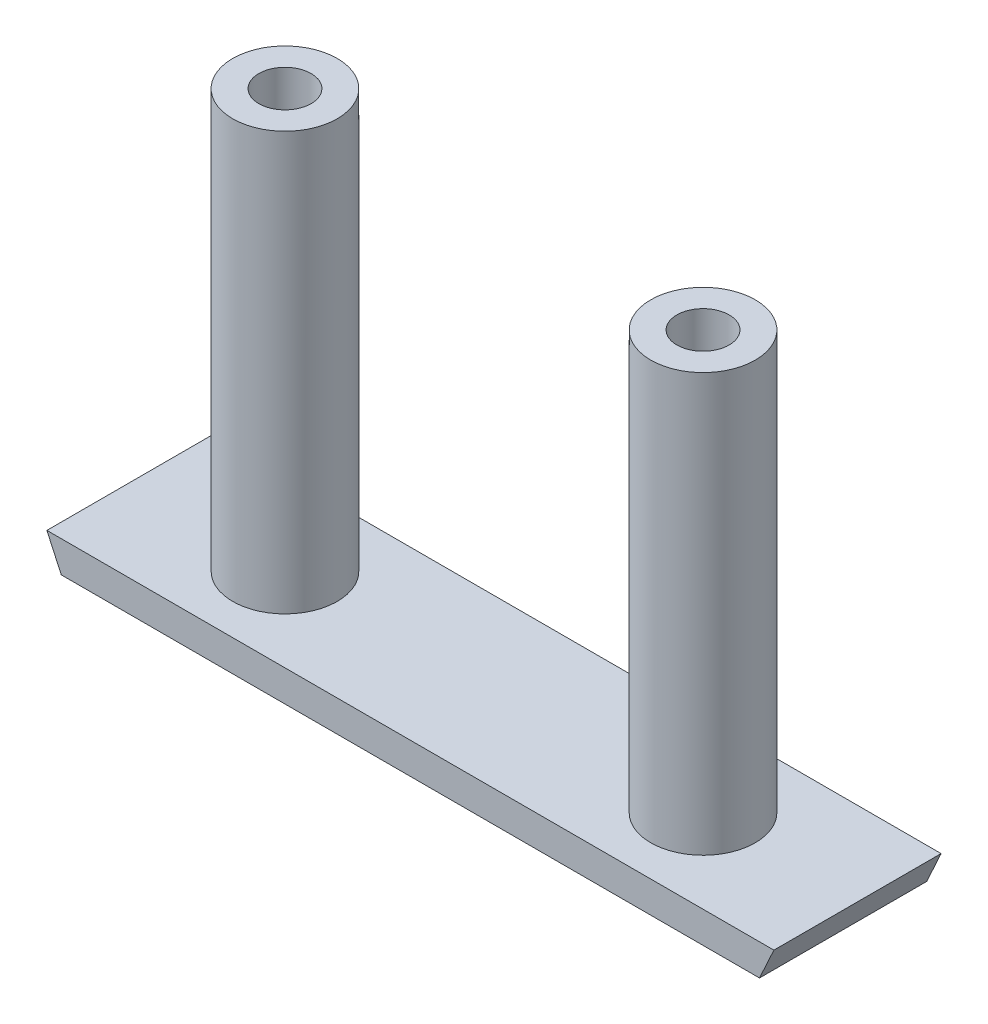
ISO-10303-21;
HEADER;
FILE_DESCRIPTION(('STEP AP214'),'2;1');
FILE_NAME('part.step','',(''),(''),'','','');
FILE_SCHEMA(('AUTOMOTIVE_DESIGN { 1 0 10303 214 1 1 1 1 }'));
ENDSEC;
DATA;
#1=APPLICATION_CONTEXT('core data for automotive mechanical design processes');
#2=APPLICATION_PROTOCOL_DEFINITION('international standard','automotive_design',2000,#1);
#3=PRODUCT_CONTEXT('',#1,'mechanical');
#4=PRODUCT('Part','Part','',(#3));
#5=PRODUCT_RELATED_PRODUCT_CATEGORY('part','',(#4));
#6=PRODUCT_DEFINITION_FORMATION('','',#4);
#7=PRODUCT_DEFINITION_CONTEXT('part definition',#1,'design');
#8=PRODUCT_DEFINITION('design','',#6,#7);
#9=PRODUCT_DEFINITION_SHAPE('','',#8);
#10=(LENGTH_UNIT() NAMED_UNIT(*) SI_UNIT(.MILLI.,.METRE.));
#11=(NAMED_UNIT(*) PLANE_ANGLE_UNIT() SI_UNIT($,.RADIAN.));
#12=(NAMED_UNIT(*) SI_UNIT($,.STERADIAN.) SOLID_ANGLE_UNIT());
#13=UNCERTAINTY_MEASURE_WITH_UNIT(LENGTH_MEASURE(1.E-05),#10,'distance_accuracy_value','');
#14=(GEOMETRIC_REPRESENTATION_CONTEXT(3) GLOBAL_UNCERTAINTY_ASSIGNED_CONTEXT((#13)) GLOBAL_UNIT_ASSIGNED_CONTEXT((#10,
#11,#12)) REPRESENTATION_CONTEXT('',''));
#15=CARTESIAN_POINT('',(0.,0.,0.));
#16=DIRECTION('',(0.,0.,1.));
#17=DIRECTION('',(1.,0.,0.));
#18=AXIS2_PLACEMENT_3D('',#15,#16,#17);
#19=CARTESIAN_POINT('',(-44.1730026373576,-17.9705,20.32));
#20=DIRECTION('',(0.908823506019507,0.417180817999115,0.));
#21=DIRECTION('',(-0.417180817999115,0.908823506019507,0.));
#22=AXIS2_PLACEMENT_3D('',#19,#20,#21);
#23=PLANE('',#22);
#24=DIRECTION('',(0.417180817999115,-0.908823506019507,0.));
#25=VECTOR('',#24,1.);
#26=CARTESIAN_POINT('',(-44.1730026373576,-17.9705,0.));
#27=LINE('',#26,#25);
#28=CARTESIAN_POINT('',(-44.1730026373576,-17.9705,0.));
#29=VERTEX_POINT('',#28);
#30=CARTESIAN_POINT('',(-42.4240833961089,-21.7805,0.));
#31=VERTEX_POINT('',#30);
#32=EDGE_CURVE('E104',#29,#31,#27,.T.);
#33=ORIENTED_EDGE('',*,*,#32,.T.);
#34=DIRECTION('',(0.,0.,-1.));
#35=VECTOR('',#34,1.);
#36=CARTESIAN_POINT('',(-42.4240833961089,-21.7805,20.32));
#37=LINE('',#36,#35);
#38=CARTESIAN_POINT('',(-42.4240833961089,-21.7805,20.32));
#39=VERTEX_POINT('',#38);
#40=EDGE_CURVE('E95',#39,#31,#37,.T.);
#41=ORIENTED_EDGE('',*,*,#40,.F.);
#42=DIRECTION('',(0.417180817999115,-0.908823506019507,0.));
#43=VECTOR('',#42,1.);
#44=CARTESIAN_POINT('',(-44.1730026373576,-17.9705,20.32));
#45=LINE('',#44,#43);
#46=CARTESIAN_POINT('',(-44.1730026373576,-17.9705,20.32));
#47=VERTEX_POINT('',#46);
#48=EDGE_CURVE('E89',#47,#39,#45,.T.);
#49=ORIENTED_EDGE('',*,*,#48,.F.);
#50=DIRECTION('',(0.,0.,-1.));
#51=VECTOR('',#50,1.);
#52=CARTESIAN_POINT('',(-44.1730026373576,-17.9705,20.32));
#53=LINE('',#52,#51);
#54=EDGE_CURVE('E100',#47,#29,#53,.T.);
#55=ORIENTED_EDGE('',*,*,#54,.T.);
#56=EDGE_LOOP('',(#33,#41,#49,#55));
#57=FACE_BOUND('',#56,.T.);
#58=ADVANCED_FACE('F37',(#57),#23,.F.);
#59=CARTESIAN_POINT('',(-42.4240833961089,-21.7805,20.32));
#60=DIRECTION('',(0.,1.,0.));
#61=DIRECTION('',(0.,0.,1.));
#62=AXIS2_PLACEMENT_3D('',#59,#60,#61);
#63=PLANE('',#62);
#64=DIRECTION('',(1.,0.,0.));
#65=VECTOR('',#64,1.);
#66=CARTESIAN_POINT('',(-42.4240833961089,-21.7805,0.));
#67=LINE('',#66,#65);
#68=CARTESIAN_POINT('',(42.4240833961089,-21.7805,0.));
#69=VERTEX_POINT('',#68);
#70=EDGE_CURVE('E94',#31,#69,#67,.T.);
#71=ORIENTED_EDGE('',*,*,#70,.T.);
#72=DIRECTION('',(0.,0.,-1.));
#73=VECTOR('',#72,1.);
#74=CARTESIAN_POINT('',(42.4240833961089,-21.7805,20.32));
#75=LINE('',#74,#73);
#76=CARTESIAN_POINT('',(42.4240833961089,-21.7805,20.32));
#77=VERTEX_POINT('',#76);
#78=EDGE_CURVE('E92',#77,#69,#75,.T.);
#79=ORIENTED_EDGE('',*,*,#78,.F.);
#80=DIRECTION('',(1.,0.,0.));
#81=VECTOR('',#80,1.);
#82=CARTESIAN_POINT('',(-42.4240833961089,-21.7805,20.32));
#83=LINE('',#82,#81);
#84=EDGE_CURVE('E84',#39,#77,#83,.T.);
#85=ORIENTED_EDGE('',*,*,#84,.F.);
#86=ORIENTED_EDGE('',*,*,#40,.T.);
#87=EDGE_LOOP('',(#71,#79,#85,#86));
#88=FACE_BOUND('',#87,.T.);
#89=ADVANCED_FACE('F93',(#88),#63,.F.);
#90=CARTESIAN_POINT('',(44.1730026373576,-17.9705,20.32));
#91=DIRECTION('',(-0.908823506019507,0.417180817999115,0.));
#92=DIRECTION('',(-0.417180817999115,-0.908823506019507,0.));
#93=AXIS2_PLACEMENT_3D('',#90,#91,#92);
#94=PLANE('',#93);
#95=DIRECTION('',(0.417180817999115,0.908823506019507,0.));
#96=VECTOR('',#95,1.);
#97=CARTESIAN_POINT('',(44.1730026373576,-17.9705,0.));
#98=LINE('',#97,#96);
#99=CARTESIAN_POINT('',(44.1730026373576,-17.9705,0.));
#100=VERTEX_POINT('',#99);
#101=EDGE_CURVE('E70',#69,#100,#98,.T.);
#102=ORIENTED_EDGE('',*,*,#101,.T.);
#103=DIRECTION('',(0.,0.,-1.));
#104=VECTOR('',#103,1.);
#105=CARTESIAN_POINT('',(44.1730026373576,-17.9705,20.32));
#106=LINE('',#105,#104);
#107=CARTESIAN_POINT('',(44.1730026373576,-17.9705,20.32));
#108=VERTEX_POINT('',#107);
#109=EDGE_CURVE('E96',#108,#100,#106,.T.);
#110=ORIENTED_EDGE('',*,*,#109,.F.);
#111=DIRECTION('',(0.417180817999115,0.908823506019507,0.));
#112=VECTOR('',#111,1.);
#113=CARTESIAN_POINT('',(44.1730026373576,-17.9705,20.32));
#114=LINE('',#113,#112);
#115=EDGE_CURVE('E87',#77,#108,#114,.T.);
#116=ORIENTED_EDGE('',*,*,#115,.F.);
#117=ORIENTED_EDGE('',*,*,#78,.T.);
#118=EDGE_LOOP('',(#102,#110,#116,#117));
#119=FACE_BOUND('',#118,.T.);
#120=ADVANCED_FACE('F98',(#119),#94,.F.);
#121=CARTESIAN_POINT('',(-44.1730026373576,-17.9705,20.32));
#122=DIRECTION('',(0.,-1.,0.));
#123=DIRECTION('',(0.,0.,-1.));
#124=AXIS2_PLACEMENT_3D('',#121,#122,#123);
#125=PLANE('',#124);
#126=CARTESIAN_POINT('',(-25.4,-17.9705,10.16));
#127=DIRECTION('',(0.,-1.,0.));
#128=DIRECTION('',(0.,0.,-1.));
#129=AXIS2_PLACEMENT_3D('',#126,#127,#128);
#130=CIRCLE('',#129,6.35);
#131=CARTESIAN_POINT('',(-25.4,-17.9705,3.81));
#132=VERTEX_POINT('',#131);
#133=EDGE_CURVE('E11',#132,#132,#130,.F.);
#134=ORIENTED_EDGE('',*,*,#133,.F.);
#135=EDGE_LOOP('',(#134));
#136=FACE_BOUND('',#135,.T.);
#137=CARTESIAN_POINT('',(25.4,-17.9705,10.16));
#138=DIRECTION('',(0.,-1.,0.));
#139=DIRECTION('',(0.,0.,-1.));
#140=AXIS2_PLACEMENT_3D('',#137,#138,#139);
#141=CIRCLE('',#140,6.35);
#142=CARTESIAN_POINT('',(25.4,-17.9705,3.81));
#143=VERTEX_POINT('',#142);
#144=EDGE_CURVE('E45',#143,#143,#141,.F.);
#145=ORIENTED_EDGE('',*,*,#144,.F.);
#146=EDGE_LOOP('',(#145));
#147=FACE_BOUND('',#146,.T.);
#148=DIRECTION('',(-1.,0.,0.));
#149=VECTOR('',#148,1.);
#150=CARTESIAN_POINT('',(-44.1730026373576,-17.9705,0.));
#151=LINE('',#150,#149);
#152=EDGE_CURVE('E76',#100,#29,#151,.T.);
#153=ORIENTED_EDGE('',*,*,#152,.T.);
#154=ORIENTED_EDGE('',*,*,#54,.F.);
#155=DIRECTION('',(-1.,0.,0.));
#156=VECTOR('',#155,1.);
#157=CARTESIAN_POINT('',(-44.1730026373576,-17.9705,20.32));
#158=LINE('',#157,#156);
#159=EDGE_CURVE('E53',#108,#47,#158,.T.);
#160=ORIENTED_EDGE('',*,*,#159,.F.);
#161=ORIENTED_EDGE('',*,*,#109,.T.);
#162=EDGE_LOOP('',(#153,#154,#160,#161));
#163=FACE_BOUND('',#162,.T.);
#164=ADVANCED_FACE('F118',(#136,#147,#163),#125,.F.);
#165=CARTESIAN_POINT('',(0.,0.,20.32));
#166=DIRECTION('',(0.,0.,1.));
#167=DIRECTION('',(1.,0.,0.));
#168=AXIS2_PLACEMENT_3D('',#165,#166,#167);
#169=PLANE('',#168);
#170=ORIENTED_EDGE('',*,*,#48,.T.);
#171=ORIENTED_EDGE('',*,*,#84,.T.);
#172=ORIENTED_EDGE('',*,*,#115,.T.);
#173=ORIENTED_EDGE('',*,*,#159,.T.);
#174=EDGE_LOOP('',(#170,#171,#172,#173));
#175=FACE_BOUND('',#174,.T.);
#176=ADVANCED_FACE('F85',(#175),#169,.T.);
#177=CARTESIAN_POINT('',(0.,0.,0.));
#178=DIRECTION('',(0.,0.,1.));
#179=DIRECTION('',(1.,0.,0.));
#180=AXIS2_PLACEMENT_3D('',#177,#178,#179);
#181=PLANE('',#180);
#182=ORIENTED_EDGE('',*,*,#32,.F.);
#183=ORIENTED_EDGE('',*,*,#152,.F.);
#184=ORIENTED_EDGE('',*,*,#101,.F.);
#185=ORIENTED_EDGE('',*,*,#70,.F.);
#186=EDGE_LOOP('',(#182,#183,#184,#185));
#187=FACE_BOUND('',#186,.T.);
#188=ADVANCED_FACE('F128',(#187),#181,.F.);
#189=CARTESIAN_POINT('',(25.4,32.8295,10.16));
#190=DIRECTION('',(0.,1.,0.));
#191=DIRECTION('',(0.,0.,1.));
#192=AXIS2_PLACEMENT_3D('',#189,#190,#191);
#193=PLANE('',#192);
#194=CARTESIAN_POINT('',(25.4,32.8295,10.16));
#195=DIRECTION('',(0.,1.,0.));
#196=DIRECTION('',(0.,0.,1.));
#197=AXIS2_PLACEMENT_3D('',#194,#195,#196);
#198=CIRCLE('',#197,6.35);
#199=CARTESIAN_POINT('',(25.4,32.8295,16.51));
#200=VERTEX_POINT('',#199);
#201=EDGE_CURVE('E107',#200,#200,#198,.T.);
#202=ORIENTED_EDGE('',*,*,#201,.T.);
#203=EDGE_LOOP('',(#202));
#204=FACE_BOUND('',#203,.T.);
#205=CARTESIAN_POINT('',(25.4,32.8295,10.16));
#206=DIRECTION('',(0.,1.,0.));
#207=DIRECTION('',(0.,0.,1.));
#208=AXIS2_PLACEMENT_3D('',#205,#206,#207);
#209=CIRCLE('',#208,3.175);
#210=CARTESIAN_POINT('',(25.4,32.8295,13.335));
#211=VERTEX_POINT('',#210);
#212=EDGE_CURVE('E186',#211,#211,#209,.T.);
#213=ORIENTED_EDGE('',*,*,#212,.F.);
#214=EDGE_LOOP('',(#213));
#215=FACE_BOUND('',#214,.T.);
#216=ADVANCED_FACE('F148',(#204,#215),#193,.T.);
#217=CARTESIAN_POINT('',(25.4,32.8295,10.16));
#218=DIRECTION('',(0.,-1.,0.));
#219=DIRECTION('',(0.,0.,-1.));
#220=AXIS2_PLACEMENT_3D('',#217,#218,#219);
#221=CYLINDRICAL_SURFACE('',#220,6.35);
#222=ORIENTED_EDGE('',*,*,#201,.F.);
#223=EDGE_LOOP('',(#222));
#224=FACE_BOUND('',#223,.T.);
#225=ORIENTED_EDGE('',*,*,#144,.T.);
#226=EDGE_LOOP('',(#225));
#227=FACE_BOUND('',#226,.T.);
#228=ADVANCED_FACE('F116',(#224,#227),#221,.T.);
#229=CARTESIAN_POINT('',(25.4,32.8295,10.16));
#230=DIRECTION('',(0.,-1.,0.));
#231=DIRECTION('',(0.,0.,-1.));
#232=AXIS2_PLACEMENT_3D('',#229,#230,#231);
#233=CYLINDRICAL_SURFACE('',#232,3.175);
#234=ORIENTED_EDGE('',*,*,#212,.T.);
#235=EDGE_LOOP('',(#234));
#236=FACE_BOUND('',#235,.T.);
#237=CARTESIAN_POINT('',(25.4,-17.9705,10.16));
#238=DIRECTION('',(0.,1.,0.));
#239=DIRECTION('',(0.,0.,1.));
#240=AXIS2_PLACEMENT_3D('',#237,#238,#239);
#241=CIRCLE('',#240,3.175);
#242=CARTESIAN_POINT('',(25.4,-17.9705,13.335));
#243=VERTEX_POINT('',#242);
#244=EDGE_CURVE('E185',#243,#243,#241,.T.);
#245=ORIENTED_EDGE('',*,*,#244,.F.);
#246=EDGE_LOOP('',(#245));
#247=FACE_BOUND('',#246,.T.);
#248=ADVANCED_FACE('F138',(#236,#247),#233,.F.);
#249=ORIENTED_EDGE('',*,*,#244,.T.);
#250=EDGE_LOOP('',(#249));
#251=FACE_BOUND('',#250,.T.);
#252=ADVANCED_FACE('F123',(#251),#125,.F.);
#253=CARTESIAN_POINT('',(-25.4,32.8295,10.16));
#254=DIRECTION('',(0.,1.,0.));
#255=DIRECTION('',(0.,0.,1.));
#256=AXIS2_PLACEMENT_3D('',#253,#254,#255);
#257=PLANE('',#256);
#258=CARTESIAN_POINT('',(-25.4,32.8295,10.16));
#259=DIRECTION('',(0.,1.,0.));
#260=DIRECTION('',(0.,0.,1.));
#261=AXIS2_PLACEMENT_3D('',#258,#259,#260);
#262=CIRCLE('',#261,6.35);
#263=CARTESIAN_POINT('',(-25.4,32.8295,16.51));
#264=VERTEX_POINT('',#263);
#265=EDGE_CURVE('E180',#264,#264,#262,.T.);
#266=ORIENTED_EDGE('',*,*,#265,.T.);
#267=EDGE_LOOP('',(#266));
#268=FACE_BOUND('',#267,.T.);
#269=CARTESIAN_POINT('',(-25.4,32.8295,10.16));
#270=DIRECTION('',(0.,1.,0.));
#271=DIRECTION('',(0.,0.,1.));
#272=AXIS2_PLACEMENT_3D('',#269,#270,#271);
#273=CIRCLE('',#272,3.175);
#274=CARTESIAN_POINT('',(-25.4,32.8295,13.335));
#275=VERTEX_POINT('',#274);
#276=EDGE_CURVE('E175',#275,#275,#273,.T.);
#277=ORIENTED_EDGE('',*,*,#276,.F.);
#278=EDGE_LOOP('',(#277));
#279=FACE_BOUND('',#278,.T.);
#280=ADVANCED_FACE('F137',(#268,#279),#257,.T.);
#281=CARTESIAN_POINT('',(-25.4,32.8295,10.16));
#282=DIRECTION('',(0.,-1.,0.));
#283=DIRECTION('',(0.,0.,-1.));
#284=AXIS2_PLACEMENT_3D('',#281,#282,#283);
#285=CYLINDRICAL_SURFACE('',#284,6.35);
#286=ORIENTED_EDGE('',*,*,#265,.F.);
#287=EDGE_LOOP('',(#286));
#288=FACE_BOUND('',#287,.T.);
#289=ORIENTED_EDGE('',*,*,#133,.T.);
#290=EDGE_LOOP('',(#289));
#291=FACE_BOUND('',#290,.T.);
#292=ADVANCED_FACE('F161',(#288,#291),#285,.T.);
#293=CARTESIAN_POINT('',(-25.4,32.8295,10.16));
#294=DIRECTION('',(0.,-1.,0.));
#295=DIRECTION('',(0.,0.,-1.));
#296=AXIS2_PLACEMENT_3D('',#293,#294,#295);
#297=CYLINDRICAL_SURFACE('',#296,3.175);
#298=ORIENTED_EDGE('',*,*,#276,.T.);
#299=EDGE_LOOP('',(#298));
#300=FACE_BOUND('',#299,.T.);
#301=CARTESIAN_POINT('',(-25.4,-17.9705,10.16));
#302=DIRECTION('',(0.,1.,0.));
#303=DIRECTION('',(0.,0.,1.));
#304=AXIS2_PLACEMENT_3D('',#301,#302,#303);
#305=CIRCLE('',#304,3.175);
#306=CARTESIAN_POINT('',(-25.4,-17.9705,13.335));
#307=VERTEX_POINT('',#306);
#308=EDGE_CURVE('E178',#307,#307,#305,.T.);
#309=ORIENTED_EDGE('',*,*,#308,.F.);
#310=EDGE_LOOP('',(#309));
#311=FACE_BOUND('',#310,.T.);
#312=ADVANCED_FACE('F134',(#300,#311),#297,.F.);
#313=ORIENTED_EDGE('',*,*,#308,.T.);
#314=EDGE_LOOP('',(#313));
#315=FACE_BOUND('',#314,.T.);
#316=ADVANCED_FACE('F122',(#315),#125,.F.);
#317=CLOSED_SHELL('',(#58,#89,#120,#164,#176,#188,#216,#228,#248,#252,#280,#292,#312,#316));
#318=MANIFOLD_SOLID_BREP('B2',#317);
#319=ADVANCED_BREP_SHAPE_REPRESENTATION('',(#18,#318),#14);
#320=SHAPE_DEFINITION_REPRESENTATION(#9,#319);
ENDSEC;
END-ISO-10303-21;
